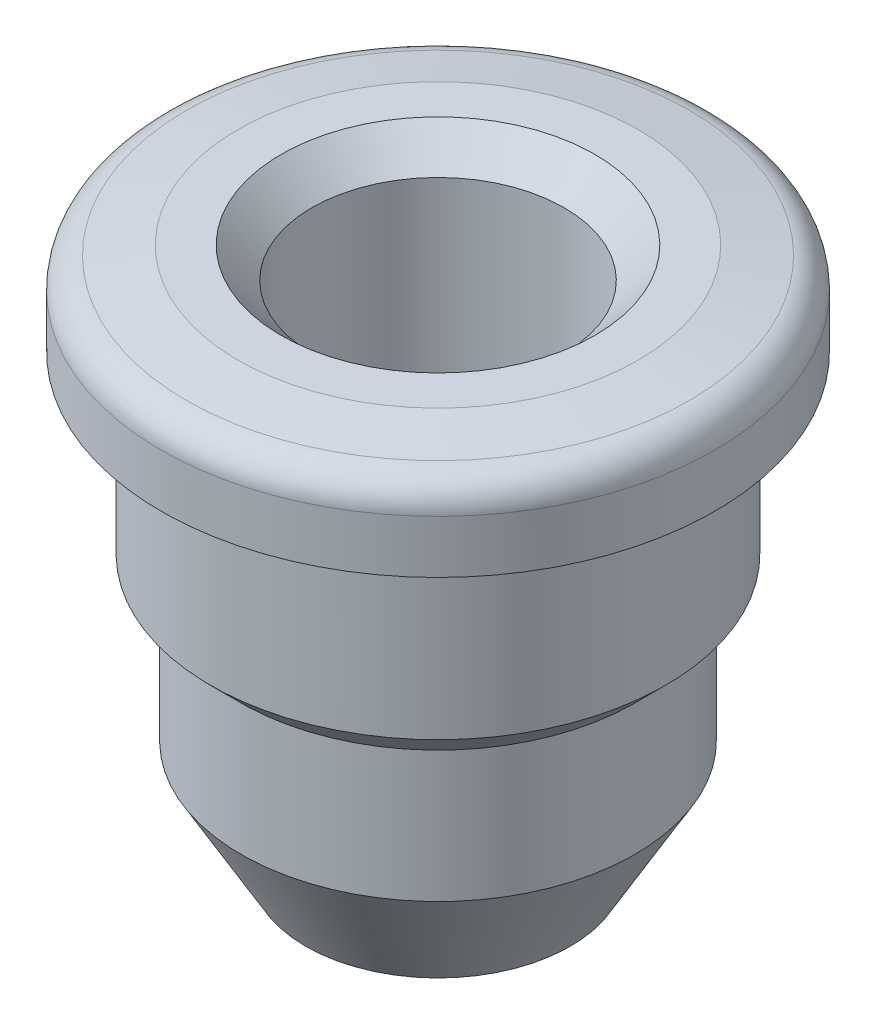
ISO-10303-21;
HEADER;
FILE_DESCRIPTION(('STEP AP214'),'2;1');
FILE_NAME('part.step','',(''),(''),'','','');
FILE_SCHEMA(('AUTOMOTIVE_DESIGN { 1 0 10303 214 1 1 1 1 }'));
ENDSEC;
DATA;
#1=APPLICATION_CONTEXT('core data for automotive mechanical design processes');
#2=APPLICATION_PROTOCOL_DEFINITION('international standard','automotive_design',2000,#1);
#3=PRODUCT_CONTEXT('',#1,'mechanical');
#4=PRODUCT('Part','Part','',(#3));
#5=PRODUCT_RELATED_PRODUCT_CATEGORY('part','',(#4));
#6=PRODUCT_DEFINITION_FORMATION('','',#4);
#7=PRODUCT_DEFINITION_CONTEXT('part definition',#1,'design');
#8=PRODUCT_DEFINITION('design','',#6,#7);
#9=PRODUCT_DEFINITION_SHAPE('','',#8);
#10=(LENGTH_UNIT() NAMED_UNIT(*) SI_UNIT(.MILLI.,.METRE.));
#11=(NAMED_UNIT(*) PLANE_ANGLE_UNIT() SI_UNIT($,.RADIAN.));
#12=(NAMED_UNIT(*) SI_UNIT($,.STERADIAN.) SOLID_ANGLE_UNIT());
#13=UNCERTAINTY_MEASURE_WITH_UNIT(LENGTH_MEASURE(1.E-05),#10,'distance_accuracy_value','');
#14=(GEOMETRIC_REPRESENTATION_CONTEXT(3) GLOBAL_UNCERTAINTY_ASSIGNED_CONTEXT((#13)) GLOBAL_UNIT_ASSIGNED_CONTEXT((#10,
#11,#12)) REPRESENTATION_CONTEXT('',''));
#15=CARTESIAN_POINT('',(0.,0.,0.));
#16=DIRECTION('',(0.,0.,1.));
#17=DIRECTION('',(1.,0.,0.));
#18=AXIS2_PLACEMENT_3D('',#15,#16,#17);
#19=CARTESIAN_POINT('',(9.2500000000002,60.25,1286.));
#20=DIRECTION('',(0.,1.,0.));
#21=DIRECTION('',(0.698582758569977,0.,-0.715529265249691));
#22=AXIS2_PLACEMENT_3D('',#19,#20,#21);
#23=CONICAL_SURFACE('',#22,2.3,0.785398163397448);
#24=CARTESIAN_POINT('',(9.25000000000018,60.5,1286.));
#25=DIRECTION('',(0.,-1.,0.));
#26=DIRECTION('',(0.698582758569957,0.,-0.71552926524971));
#27=AXIS2_PLACEMENT_3D('',#24,#25,#26);
#28=CIRCLE('',#27,2.55);
#29=CARTESIAN_POINT('',(11.0313860343536,60.5,1284.17540037361));
#30=VERTEX_POINT('',#29);
#31=EDGE_CURVE('E23',#30,#30,#28,.T.);
#32=ORIENTED_EDGE('',*,*,#31,.F.);
#33=EDGE_LOOP('',(#32));
#34=FACE_BOUND('',#33,.T.);
#35=CARTESIAN_POINT('',(9.25000000000019,60.,1286.));
#36=DIRECTION('',(0.,1.,0.));
#37=DIRECTION('',(-0.698582758569974,0.,0.715529265249694));
#38=AXIS2_PLACEMENT_3D('',#35,#36,#37);
#39=CIRCLE('',#38,2.05);
#40=CARTESIAN_POINT('',(7.81790534493174,60.,1287.46683499376));
#41=VERTEX_POINT('',#40);
#42=EDGE_CURVE('E32',#41,#41,#39,.T.);
#43=ORIENTED_EDGE('',*,*,#42,.F.);
#44=EDGE_LOOP('',(#43));
#45=FACE_BOUND('',#44,.T.);
#46=ADVANCED_FACE('F15',(#34,#45),#23,.F.);
#47=CARTESIAN_POINT('',(11.5203939653519,60.5,1283.67452988794));
#48=DIRECTION('',(0.,1.,0.));
#49=DIRECTION('',(0.698582758569977,0.,-0.715529265249691));
#50=AXIS2_PLACEMENT_3D('',#47,#48,#49);
#51=PLANE('',#50);
#52=CARTESIAN_POINT('',(9.25000000000018,60.5,1286.));
#53=DIRECTION('',(0.,1.,0.));
#54=DIRECTION('',(0.69858275856999,0.,-0.715529265249678));
#55=AXIS2_PLACEMENT_3D('',#52,#53,#54);
#56=CIRCLE('',#55,3.25);
#57=CARTESIAN_POINT('',(11.5203939653526,60.5,1283.67452988794));
#58=VERTEX_POINT('',#57);
#59=EDGE_CURVE('E10',#58,#58,#56,.T.);
#60=ORIENTED_EDGE('',*,*,#59,.T.);
#61=EDGE_LOOP('',(#60));
#62=FACE_BOUND('',#61,.T.);
#63=ORIENTED_EDGE('',*,*,#31,.T.);
#64=EDGE_LOOP('',(#63));
#65=FACE_BOUND('',#64,.T.);
#66=ADVANCED_FACE('F64',(#62,#65),#51,.T.);
#67=CARTESIAN_POINT('',(9.2500000000002,60.42622266751,1286.));
#68=DIRECTION('',(0.,-1.,0.));
#69=DIRECTION('',(0.698582758569977,0.,-0.715529265249691));
#70=AXIS2_PLACEMENT_3D('',#67,#68,#69);
#71=CONICAL_SURFACE('',#70,3.668412044417,1.39626340159546);
#72=CARTESIAN_POINT('',(9.25000000000019,60.35244533503,1286.));
#73=DIRECTION('',(0.,-1.,0.));
#74=DIRECTION('',(-0.698582758569987,0.,0.71552926524968));
#75=AXIS2_PLACEMENT_3D('',#72,#73,#74);
#76=CIRCLE('',#75,4.086824088833);
#77=CARTESIAN_POINT('',(6.39501515423296,60.35244533503,1288.92424223749));
#78=VERTEX_POINT('',#77);
#79=EDGE_CURVE('E28',#78,#78,#76,.T.);
#80=ORIENTED_EDGE('',*,*,#79,.F.);
#81=EDGE_LOOP('',(#80));
#82=FACE_BOUND('',#81,.T.);
#83=ORIENTED_EDGE('',*,*,#59,.F.);
#84=EDGE_LOOP('',(#83));
#85=FACE_BOUND('',#84,.T.);
#86=ADVANCED_FACE('F71',(#82,#85),#71,.T.);
#87=CARTESIAN_POINT('',(9.25000000000018,59.86004145852,1286.));
#88=DIRECTION('',(0.,1.,0.));
#89=DIRECTION('',(0.698582758569986,0.,-0.715529265249682));
#90=AXIS2_PLACEMENT_3D('',#87,#88,#89);
#91=TOROIDAL_SURFACE('',#90,4.,0.5);
#92=ORIENTED_EDGE('',*,*,#79,.T.);
#93=EDGE_LOOP('',(#92));
#94=FACE_BOUND('',#93,.T.);
#95=CARTESIAN_POINT('',(9.25000000000018,59.86004145852,1286.));
#96=DIRECTION('',(0.,1.,0.));
#97=DIRECTION('',(-0.698582758569986,0.,0.715529265249682));
#98=AXIS2_PLACEMENT_3D('',#95,#96,#97);
#99=CIRCLE('',#98,4.5);
#100=CARTESIAN_POINT('',(6.10637758643524,59.86004145852,1289.21988169362));
#101=VERTEX_POINT('',#100);
#102=EDGE_CURVE('E35',#101,#101,#99,.T.);
#103=ORIENTED_EDGE('',*,*,#102,.T.);
#104=EDGE_LOOP('',(#103));
#105=FACE_BOUND('',#104,.T.);
#106=ADVANCED_FACE('F77',(#94,#105),#91,.T.);
#107=CARTESIAN_POINT('',(9.25000000000018,59.,1286.));
#108=DIRECTION('',(0.,1.,0.));
#109=DIRECTION('',(0.698582758569986,0.,-0.715529265249682));
#110=AXIS2_PLACEMENT_3D('',#107,#108,#109);
#111=CYLINDRICAL_SURFACE('',#110,4.5);
#112=ORIENTED_EDGE('',*,*,#102,.F.);
#113=EDGE_LOOP('',(#112));
#114=FACE_BOUND('',#113,.T.);
#115=CARTESIAN_POINT('',(9.25000000000018,59.,1286.));
#116=DIRECTION('',(0.,-1.,0.));
#117=DIRECTION('',(0.698582758569986,0.,-0.715529265249682));
#118=AXIS2_PLACEMENT_3D('',#115,#116,#117);
#119=CIRCLE('',#118,4.5);
#120=CARTESIAN_POINT('',(12.3936224135651,59.,1282.78011830638));
#121=VERTEX_POINT('',#120);
#122=EDGE_CURVE('E38',#121,#121,#119,.T.);
#123=ORIENTED_EDGE('',*,*,#122,.F.);
#124=EDGE_LOOP('',(#123));
#125=FACE_BOUND('',#124,.T.);
#126=ADVANCED_FACE('F81',(#114,#125),#111,.T.);
#127=CARTESIAN_POINT('',(11.8347562067084,59.,1283.35254171858));
#128=DIRECTION('',(0.,-1.,0.));
#129=DIRECTION('',(-0.698582758569977,0.,0.715529265249691));
#130=AXIS2_PLACEMENT_3D('',#127,#128,#129);
#131=PLANE('',#130);
#132=ORIENTED_EDGE('',*,*,#122,.T.);
#133=EDGE_LOOP('',(#132));
#134=FACE_BOUND('',#133,.T.);
#135=CARTESIAN_POINT('',(9.25000000000018,59.,1286.));
#136=DIRECTION('',(0.,1.,0.));
#137=DIRECTION('',(0.698582758569989,0.,-0.715529265249678));
#138=AXIS2_PLACEMENT_3D('',#135,#136,#137);
#139=CIRCLE('',#138,3.7);
#140=CARTESIAN_POINT('',(11.8347562067091,59.,1283.35254171858));
#141=VERTEX_POINT('',#140);
#142=EDGE_CURVE('E41',#141,#141,#139,.T.);
#143=ORIENTED_EDGE('',*,*,#142,.T.);
#144=EDGE_LOOP('',(#143));
#145=FACE_BOUND('',#144,.T.);
#146=ADVANCED_FACE('F85',(#134,#145),#131,.T.);
#147=CARTESIAN_POINT('',(9.25000000000018,56.15,1286.));
#148=DIRECTION('',(0.,1.,0.));
#149=DIRECTION('',(0.698582758569989,0.,-0.715529265249678));
#150=AXIS2_PLACEMENT_3D('',#147,#148,#149);
#151=CYLINDRICAL_SURFACE('',#150,3.7);
#152=ORIENTED_EDGE('',*,*,#142,.F.);
#153=EDGE_LOOP('',(#152));
#154=FACE_BOUND('',#153,.T.);
#155=CARTESIAN_POINT('',(9.25000000000018,56.15,1286.));
#156=DIRECTION('',(0.,-1.,0.));
#157=DIRECTION('',(-0.698582758569989,0.,0.715529265249678));
#158=AXIS2_PLACEMENT_3D('',#155,#156,#157);
#159=CIRCLE('',#158,3.7);
#160=CARTESIAN_POINT('',(6.66524379329122,56.15,1288.64745828142));
#161=VERTEX_POINT('',#160);
#162=EDGE_CURVE('E44',#161,#161,#159,.T.);
#163=ORIENTED_EDGE('',*,*,#162,.F.);
#164=EDGE_LOOP('',(#163));
#165=FACE_BOUND('',#164,.T.);
#166=ADVANCED_FACE('F89',(#154,#165),#151,.T.);
#167=CARTESIAN_POINT('',(9.25000000000018,55.9,1286.));
#168=DIRECTION('',(0.,1.,0.));
#169=DIRECTION('',(0.698582758569977,0.,-0.715529265249691));
#170=AXIS2_PLACEMENT_3D('',#167,#168,#169);
#171=CONICAL_SURFACE('',#170,3.45,0.785398163397448);
#172=ORIENTED_EDGE('',*,*,#162,.T.);
#173=EDGE_LOOP('',(#172));
#174=FACE_BOUND('',#173,.T.);
#175=CARTESIAN_POINT('',(9.25000000000019,55.65,1286.));
#176=DIRECTION('',(0.,1.,0.));
#177=DIRECTION('',(0.69858275856997,0.,-0.715529265249697));
#178=AXIS2_PLACEMENT_3D('',#175,#176,#177);
#179=CIRCLE('',#178,3.2);
#180=CARTESIAN_POINT('',(11.4854648274241,55.65,1283.7103063512));
#181=VERTEX_POINT('',#180);
#182=EDGE_CURVE('E47',#181,#181,#179,.T.);
#183=ORIENTED_EDGE('',*,*,#182,.T.);
#184=EDGE_LOOP('',(#183));
#185=FACE_BOUND('',#184,.T.);
#186=ADVANCED_FACE('F93',(#174,#185),#171,.T.);
#187=CARTESIAN_POINT('',(9.25000000000017,53.51865334794,1286.));
#188=DIRECTION('',(0.,1.,0.));
#189=DIRECTION('',(0.69858275856997,0.,-0.715529265249697));
#190=AXIS2_PLACEMENT_3D('',#187,#188,#189);
#191=CYLINDRICAL_SURFACE('',#190,3.2);
#192=ORIENTED_EDGE('',*,*,#182,.F.);
#193=EDGE_LOOP('',(#192));
#194=FACE_BOUND('',#193,.T.);
#195=CARTESIAN_POINT('',(9.25000000000017,53.51865334794,1286.));
#196=DIRECTION('',(0.,-1.,0.));
#197=DIRECTION('',(-0.69858275856997,0.,0.715529265249697));
#198=AXIS2_PLACEMENT_3D('',#195,#196,#197);
#199=CIRCLE('',#198,3.2);
#200=CARTESIAN_POINT('',(7.01453517257627,53.51865334794,1288.2896936488));
#201=VERTEX_POINT('',#200);
#202=EDGE_CURVE('E50',#201,#201,#199,.T.);
#203=ORIENTED_EDGE('',*,*,#202,.F.);
#204=EDGE_LOOP('',(#203));
#205=FACE_BOUND('',#204,.T.);
#206=ADVANCED_FACE('F97',(#194,#205),#191,.T.);
#207=CARTESIAN_POINT('',(9.25000000000017,52.60932667397,1286.));
#208=DIRECTION('',(0.,1.,0.));
#209=DIRECTION('',(0.698582758569977,0.,-0.715529265249691));
#210=AXIS2_PLACEMENT_3D('',#207,#208,#209);
#211=CONICAL_SURFACE('',#210,2.675,0.523598775598299);
#212=ORIENTED_EDGE('',*,*,#202,.T.);
#213=EDGE_LOOP('',(#212));
#214=FACE_BOUND('',#213,.T.);
#215=CARTESIAN_POINT('',(9.25000000000017,51.7,1286.));
#216=DIRECTION('',(0.,-1.,0.));
#217=DIRECTION('',(-0.69858275856998,0.,0.715529265249687));
#218=AXIS2_PLACEMENT_3D('',#215,#216,#217);
#219=CIRCLE('',#218,2.15);
#220=CARTESIAN_POINT('',(7.74804706907471,51.7,1287.53838792029));
#221=VERTEX_POINT('',#220);
#222=EDGE_CURVE('E52',#221,#221,#219,.T.);
#223=ORIENTED_EDGE('',*,*,#222,.F.);
#224=EDGE_LOOP('',(#223));
#225=FACE_BOUND('',#224,.T.);
#226=ADVANCED_FACE('F101',(#214,#225),#211,.T.);
#227=CARTESIAN_POINT('',(10.6820946550679,51.7,1284.53316500624));
#228=DIRECTION('',(0.,-1.,0.));
#229=DIRECTION('',(-0.698582758569977,0.,0.715529265249691));
#230=AXIS2_PLACEMENT_3D('',#227,#228,#229);
#231=PLANE('',#230);
#232=ORIENTED_EDGE('',*,*,#222,.T.);
#233=EDGE_LOOP('',(#232));
#234=FACE_BOUND('',#233,.T.);
#235=CARTESIAN_POINT('',(9.25000000000017,51.7,1286.));
#236=DIRECTION('',(0.,1.,0.));
#237=DIRECTION('',(0.698582758569974,0.,-0.715529265249694));
#238=AXIS2_PLACEMENT_3D('',#235,#236,#237);
#239=CIRCLE('',#238,2.05);
#240=CARTESIAN_POINT('',(10.6820946550686,51.7,1284.53316500624));
#241=VERTEX_POINT('',#240);
#242=EDGE_CURVE('E19',#241,#241,#239,.T.);
#243=ORIENTED_EDGE('',*,*,#242,.T.);
#244=EDGE_LOOP('',(#243));
#245=FACE_BOUND('',#244,.T.);
#246=ADVANCED_FACE('F104',(#234,#245),#231,.T.);
#247=CARTESIAN_POINT('',(9.25000000000019,60.,1286.));
#248=DIRECTION('',(0.,-1.,0.));
#249=DIRECTION('',(0.698582758569973,0.,-0.715529265249693));
#250=AXIS2_PLACEMENT_3D('',#247,#248,#249);
#251=CYLINDRICAL_SURFACE('',#250,2.05);
#252=ORIENTED_EDGE('',*,*,#242,.F.);
#253=EDGE_LOOP('',(#252));
#254=FACE_BOUND('',#253,.T.);
#255=ORIENTED_EDGE('',*,*,#42,.T.);
#256=EDGE_LOOP('',(#255));
#257=FACE_BOUND('',#256,.T.);
#258=ADVANCED_FACE('F17',(#254,#257),#251,.F.);
#259=CLOSED_SHELL('',(#46,#66,#86,#106,#126,#146,#166,#186,#206,#226,#246,#258));
#260=MANIFOLD_SOLID_BREP('B1',#259);
#261=ADVANCED_BREP_SHAPE_REPRESENTATION('',(#18,#260),#14);
#262=SHAPE_DEFINITION_REPRESENTATION(#9,#261);
ENDSEC;
END-ISO-10303-21;
